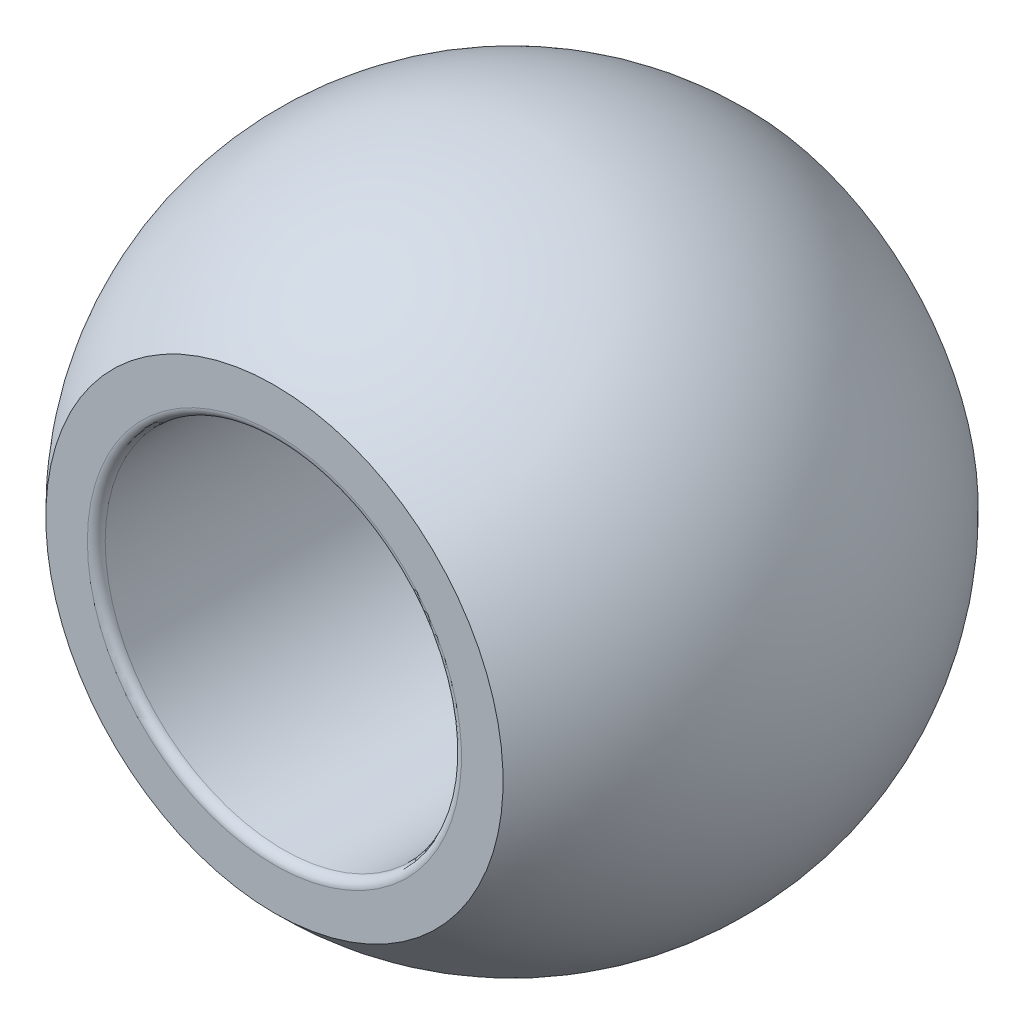
ISO-10303-21;
HEADER;
FILE_DESCRIPTION(('STEP AP214'),'2;1');
FILE_NAME('part.step','',(''),(''),'','','');
FILE_SCHEMA(('AUTOMOTIVE_DESIGN { 1 0 10303 214 1 1 1 1 }'));
ENDSEC;
DATA;
#1=APPLICATION_CONTEXT('core data for automotive mechanical design processes');
#2=APPLICATION_PROTOCOL_DEFINITION('international standard','automotive_design',2000,#1);
#3=PRODUCT_CONTEXT('',#1,'mechanical');
#4=PRODUCT('Part','Part','',(#3));
#5=PRODUCT_RELATED_PRODUCT_CATEGORY('part','',(#4));
#6=PRODUCT_DEFINITION_FORMATION('','',#4);
#7=PRODUCT_DEFINITION_CONTEXT('part definition',#1,'design');
#8=PRODUCT_DEFINITION('design','',#6,#7);
#9=PRODUCT_DEFINITION_SHAPE('','',#8);
#10=(LENGTH_UNIT() NAMED_UNIT(*) SI_UNIT(.MILLI.,.METRE.));
#11=(NAMED_UNIT(*) PLANE_ANGLE_UNIT() SI_UNIT($,.RADIAN.));
#12=(NAMED_UNIT(*) SI_UNIT($,.STERADIAN.) SOLID_ANGLE_UNIT());
#13=UNCERTAINTY_MEASURE_WITH_UNIT(LENGTH_MEASURE(1.E-05),#10,'distance_accuracy_value','');
#14=(GEOMETRIC_REPRESENTATION_CONTEXT(3) GLOBAL_UNCERTAINTY_ASSIGNED_CONTEXT((#13)) GLOBAL_UNIT_ASSIGNED_CONTEXT((#10,
#11,#12)) REPRESENTATION_CONTEXT('',''));
#15=CARTESIAN_POINT('',(0.,0.,0.));
#16=DIRECTION('',(0.,0.,1.));
#17=DIRECTION('',(1.,0.,0.));
#18=AXIS2_PLACEMENT_3D('',#15,#16,#17);
#19=CARTESIAN_POINT('',(0.,-1.06512021424976E-12,0.));
#20=DIRECTION('',(0.,0.,-1.));
#21=DIRECTION('',(0.,1.,0.));
#22=AXIS2_PLACEMENT_3D('',#19,#20,#21);
#23=SPHERICAL_SURFACE('',#22,11.1036030188411);
#24=CARTESIAN_POINT('',(0.,-1.06512021424976E-12,8.));
#25=DIRECTION('',(0.,0.,-1.));
#26=DIRECTION('',(-1.,1.38327300551917E-13,0.));
#27=AXIS2_PLACEMENT_3D('',#24,#25,#26);
#28=CIRCLE('',#27,7.70000000000106);
#29=CARTESIAN_POINT('',(0.,7.69999999999999,8.));
#30=VERTEX_POINT('',#29);
#31=EDGE_CURVE('E38',#30,#30,#28,.T.);
#32=CARTESIAN_POINT('',(0.,-1.06512021424976E-12,-8.));
#33=DIRECTION('',(0.,0.,-1.));
#34=DIRECTION('',(-1.,1.38327300551917E-13,0.));
#35=AXIS2_PLACEMENT_3D('',#32,#33,#34);
#36=CIRCLE('',#35,7.70000000000106);
#37=CARTESIAN_POINT('',(0.,7.7,-8.));
#38=VERTEX_POINT('',#37);
#39=EDGE_CURVE('E35',#38,#38,#36,.T.);
#40=CARTESIAN_POINT('',(0.,7.69999999999999,8.));
#41=CARTESIAN_POINT('',(0.,7.83408711092795,7.87094704425255));
#42=CARTESIAN_POINT('',(0.,7.96492361407604,7.73851736693083));
#43=CARTESIAN_POINT('',(0.,8.21977828230315,7.46725208171387));
#44=CARTESIAN_POINT('',(0.,8.34379644738217,7.32841647381865));
#45=CARTESIAN_POINT('',(0.,8.58469731696184,7.04468684002973));
#46=CARTESIAN_POINT('',(0.,8.70158002146248,6.89979281413604));
#47=CARTESIAN_POINT('',(0.,8.92791550168366,6.60431350947384));
#48=CARTESIAN_POINT('',(0.,9.0373682774042,6.45372823070532));
#49=CARTESIAN_POINT('',(0.,9.24856697507944,6.14724680863047));
#50=CARTESIAN_POINT('',(0.,9.35031289703414,5.99135066532415));
#51=CARTESIAN_POINT('',(0.,9.54584077434508,5.67464163827379));
#52=CARTESIAN_POINT('',(0.,9.63962272970132,5.51382875452976));
#53=CARTESIAN_POINT('',(0.,9.81898560263913,5.18769271526851));
#54=CARTESIAN_POINT('',(0.,9.9045665202207,5.02236955975129));
#55=CARTESIAN_POINT('',(0.,10.0673109999795,4.68763086857531));
#56=CARTESIAN_POINT('',(0.,10.1444745621567,4.51821533291656));
#57=CARTESIAN_POINT('',(0.,10.2901892836256,4.175720111395));
#58=CARTESIAN_POINT('',(0.,10.3587404429173,4.0026404255322));
#59=CARTESIAN_POINT('',(0.,10.4870570823915,3.65325439700859));
#60=CARTESIAN_POINT('',(0.,10.5468225625738,3.47694805434779));
#61=CARTESIAN_POINT('',(0.,10.6574167746855,3.12155436121588));
#62=CARTESIAN_POINT('',(0.,10.7082455066147,2.94246701074478));
#63=CARTESIAN_POINT('',(0.,10.8008377425939,2.58196398064138));
#64=CARTESIAN_POINT('',(0.,10.8426012466439,2.40054830100908));
#65=CARTESIAN_POINT('',(0.,10.9169574613583,2.03584717651303));
#66=CARTESIAN_POINT('',(0.,10.9495501720228,1.85256173164926));
#67=CARTESIAN_POINT('',(0.,11.005482415459,1.48458436682891));
#68=CARTESIAN_POINT('',(0.,11.0288219482307,1.29989244687233));
#69=CARTESIAN_POINT('',(0.,11.0661888406054,0.929568977146169));
#70=CARTESIAN_POINT('',(0.,11.0802162002084,0.743937427376595));
#71=CARTESIAN_POINT('',(0.,11.0989232893257,0.372203918404681));
#72=CARTESIAN_POINT('',(0.,11.10360301884,0.186101959202342));
#73=CARTESIAN_POINT('',(0.,11.10360301884,-0.186101959202337));
#74=CARTESIAN_POINT('',(0.,11.0989232893257,-0.372203918404676));
#75=CARTESIAN_POINT('',(0.,11.0802162002084,-0.74393742737659));
#76=CARTESIAN_POINT('',(0.,11.0661888406054,-0.929568977146165));
#77=CARTESIAN_POINT('',(0.,11.0288219482307,-1.29989244687232));
#78=CARTESIAN_POINT('',(0.,11.005482415459,-1.48458436682891));
#79=CARTESIAN_POINT('',(0.,10.9495501720228,-1.85256173164926));
#80=CARTESIAN_POINT('',(0.,10.9169574613583,-2.03584717651302));
#81=CARTESIAN_POINT('',(0.,10.8426012466439,-2.40054830100908));
#82=CARTESIAN_POINT('',(0.,10.8008377425939,-2.58196398064137));
#83=CARTESIAN_POINT('',(0.,10.7082455066147,-2.94246701074477));
#84=CARTESIAN_POINT('',(0.,10.6574167746855,-3.12155436121587));
#85=CARTESIAN_POINT('',(0.,10.5468225625738,-3.47694805434778));
#86=CARTESIAN_POINT('',(0.,10.4870570823915,-3.65325439700859));
#87=CARTESIAN_POINT('',(0.,10.3587404429173,-4.00264042553219));
#88=CARTESIAN_POINT('',(0.,10.2901892836256,-4.175720111395));
#89=CARTESIAN_POINT('',(0.,10.1444745621567,-4.51821533291655));
#90=CARTESIAN_POINT('',(0.,10.0673109999795,-4.68763086857531));
#91=CARTESIAN_POINT('',(0.,9.90456652022071,-5.02236955975128));
#92=CARTESIAN_POINT('',(0.,9.81898560263913,-5.1876927152685));
#93=CARTESIAN_POINT('',(0.,9.63962272970132,-5.51382875452975));
#94=CARTESIAN_POINT('',(0.,9.54584077434508,-5.67464163827379));
#95=CARTESIAN_POINT('',(0.,9.35031289703414,-5.99135066532414));
#96=CARTESIAN_POINT('',(0.,9.24856697507944,-6.14724680863047));
#97=CARTESIAN_POINT('',(0.,9.0373682774042,-6.45372823070531));
#98=CARTESIAN_POINT('',(0.,8.92791550168367,-6.60431350947383));
#99=CARTESIAN_POINT('',(0.,8.70158002146248,-6.89979281413604));
#100=CARTESIAN_POINT('',(0.,8.58469731696184,-7.04468684002973));
#101=CARTESIAN_POINT('',(0.,8.34379644738217,-7.32841647381864));
#102=CARTESIAN_POINT('',(0.,8.21977828230315,-7.46725208171387));
#103=CARTESIAN_POINT('',(0.,7.96492361407604,-7.73851736693082));
#104=CARTESIAN_POINT('',(0.,7.83408711092795,-7.87094704425255));
#105=CARTESIAN_POINT('',(0.,7.7,-8.));
#106=B_SPLINE_CURVE_WITH_KNOTS('',3,(#40,#41,#42,#43,#44,#45,#46,#47,#48,#49,#50,#51,#52,#53,
#54,#55,#56,#57,#58,#59,#60,#61,#62,#63,#64,#65,#66,#67,#68,#69,#70,#71,#72,#73,#74,#75,#76,#77,
#78,#79,#80,#81,#82,#83,#84,#85,#86,#87,#88,#89,#90,#91,#92,#93,#94,#95,#96,#97,#98,#99,#100,
#101,#102,#103,#104,#105),.UNSPECIFIED.,.F.,.F.,(4,2,2,2,2,2,2,2,2,2,2,2,2,2,2,2,2,2,2,2,2,2,2,
2,2,2,2,2,2,2,2,2,4),(0.,0.558247085726217,1.11649417145243,1.67474125717865,2.23298834290487,
2.79123542863108,3.3494825143573,3.90772960008351,4.46597668580973,5.02422377153595,
5.58247085726216,6.14071794298838,6.69896502871459,7.25721211444081,7.81545920016703,
8.37370628589324,8.93195337161946,9.49020045734567,10.0484475430719,10.6066946287981,
11.1649417145243,11.7231888002505,12.2814358859768,12.839682971703,13.3979300574292,
13.9561771431554,14.5144242288816,15.0726713146078,15.6309184003341,16.1891654860603,
16.7474125717865,17.3056596575127,17.8639067432389),.UNSPECIFIED.);
#107=EDGE_CURVE('BSEAM15',#30,#38,#106,.T.);
#108=ORIENTED_EDGE('',*,*,#31,.T.);
#109=ORIENTED_EDGE('',*,*,#39,.F.);
#110=ORIENTED_EDGE('',*,*,#107,.T.);
#111=ORIENTED_EDGE('',*,*,#107,.F.);
#112=EDGE_LOOP('',(#108,#110,#109,#111));
#113=FACE_BOUND('',#112,.T.);
#114=ADVANCED_FACE('F15',(#113),#23,.T.);
#115=CARTESIAN_POINT('',(0.,7.7,8.));
#116=DIRECTION('',(0.,0.,1.));
#117=DIRECTION('',(1.,0.,0.));
#118=AXIS2_PLACEMENT_3D('',#115,#116,#117);
#119=PLANE('',#118);
#120=CARTESIAN_POINT('',(0.,0.,8.));
#121=DIRECTION('',(0.,0.,-1.));
#122=DIRECTION('',(-1.,0.,0.));
#123=AXIS2_PLACEMENT_3D('',#120,#121,#122);
#124=CIRCLE('',#123,6.30000005327022);
#125=CARTESIAN_POINT('',(-6.30000005327022,0.,8.));
#126=VERTEX_POINT('',#125);
#127=EDGE_CURVE('E30',#126,#126,#124,.T.);
#128=ORIENTED_EDGE('',*,*,#127,.T.);
#129=EDGE_LOOP('',(#128));
#130=FACE_BOUND('',#129,.T.);
#131=ORIENTED_EDGE('',*,*,#31,.F.);
#132=EDGE_LOOP('',(#131));
#133=FACE_BOUND('',#132,.T.);
#134=ADVANCED_FACE('F44',(#130,#133),#119,.T.);
#135=CARTESIAN_POINT('',(0.,0.,7.70000000000013));
#136=DIRECTION('',(0.,0.,-1.));
#137=DIRECTION('',(-1.,0.,0.));
#138=AXIS2_PLACEMENT_3D('',#135,#136,#137);
#139=TOROIDAL_SURFACE('',#138,6.29999999999987,0.299999999999874);
#140=CARTESIAN_POINT('',(0.,0.,7.7));
#141=DIRECTION('',(0.,0.,-1.));
#142=DIRECTION('',(-1.,0.,0.));
#143=AXIS2_PLACEMENT_3D('',#140,#141,#142);
#144=CIRCLE('',#143,6.);
#145=CARTESIAN_POINT('',(-6.,0.,7.7));
#146=VERTEX_POINT('',#145);
#147=EDGE_CURVE('E26',#146,#146,#144,.T.);
#148=ORIENTED_EDGE('',*,*,#147,.T.);
#149=EDGE_LOOP('',(#148));
#150=FACE_BOUND('',#149,.T.);
#151=ORIENTED_EDGE('',*,*,#127,.F.);
#152=EDGE_LOOP('',(#151));
#153=FACE_BOUND('',#152,.T.);
#154=ADVANCED_FACE('F46',(#150,#153),#139,.T.);
#155=CARTESIAN_POINT('',(0.,0.,-50.));
#156=DIRECTION('',(0.,0.,-1.));
#157=DIRECTION('',(-1.,0.,0.));
#158=AXIS2_PLACEMENT_3D('',#155,#156,#157);
#159=CYLINDRICAL_SURFACE('',#158,6.);
#160=CARTESIAN_POINT('',(0.,0.,-7.7));
#161=DIRECTION('',(0.,0.,-1.));
#162=DIRECTION('',(-1.,0.,0.));
#163=AXIS2_PLACEMENT_3D('',#160,#161,#162);
#164=CIRCLE('',#163,6.);
#165=CARTESIAN_POINT('',(-6.,0.,-7.7));
#166=VERTEX_POINT('',#165);
#167=EDGE_CURVE('E22',#166,#166,#164,.T.);
#168=ORIENTED_EDGE('',*,*,#167,.T.);
#169=EDGE_LOOP('',(#168));
#170=FACE_BOUND('',#169,.T.);
#171=ORIENTED_EDGE('',*,*,#147,.F.);
#172=EDGE_LOOP('',(#171));
#173=FACE_BOUND('',#172,.T.);
#174=ADVANCED_FACE('F54',(#170,#173),#159,.F.);
#175=CARTESIAN_POINT('',(0.,0.,-7.70000000000013));
#176=DIRECTION('',(0.,0.,-1.));
#177=DIRECTION('',(-1.,0.,0.));
#178=AXIS2_PLACEMENT_3D('',#175,#176,#177);
#179=TOROIDAL_SURFACE('',#178,6.29999999999987,0.299999999999874);
#180=CARTESIAN_POINT('',(0.,0.,-8.));
#181=DIRECTION('',(0.,0.,-1.));
#182=DIRECTION('',(-1.,0.,0.));
#183=AXIS2_PLACEMENT_3D('',#180,#181,#182);
#184=CIRCLE('',#183,6.30000005327022);
#185=CARTESIAN_POINT('',(-6.30000005327022,0.,-8.));
#186=VERTEX_POINT('',#185);
#187=EDGE_CURVE('E10',#186,#186,#184,.T.);
#188=ORIENTED_EDGE('',*,*,#187,.T.);
#189=EDGE_LOOP('',(#188));
#190=FACE_BOUND('',#189,.T.);
#191=ORIENTED_EDGE('',*,*,#167,.F.);
#192=EDGE_LOOP('',(#191));
#193=FACE_BOUND('',#192,.T.);
#194=ADVANCED_FACE('F60',(#190,#193),#179,.T.);
#195=CARTESIAN_POINT('',(0.,6.3,-8.));
#196=DIRECTION('',(0.,0.,-1.));
#197=DIRECTION('',(-1.,0.,0.));
#198=AXIS2_PLACEMENT_3D('',#195,#196,#197);
#199=PLANE('',#198);
#200=ORIENTED_EDGE('',*,*,#39,.T.);
#201=EDGE_LOOP('',(#200));
#202=FACE_BOUND('',#201,.T.);
#203=ORIENTED_EDGE('',*,*,#187,.F.);
#204=EDGE_LOOP('',(#203));
#205=FACE_BOUND('',#204,.T.);
#206=ADVANCED_FACE('F17',(#202,#205),#199,.T.);
#207=CLOSED_SHELL('',(#114,#134,#154,#174,#194,#206));
#208=MANIFOLD_SOLID_BREP('B1',#207);
#209=ADVANCED_BREP_SHAPE_REPRESENTATION('',(#18,#208),#14);
#210=SHAPE_DEFINITION_REPRESENTATION(#9,#209);
ENDSEC;
END-ISO-10303-21;
